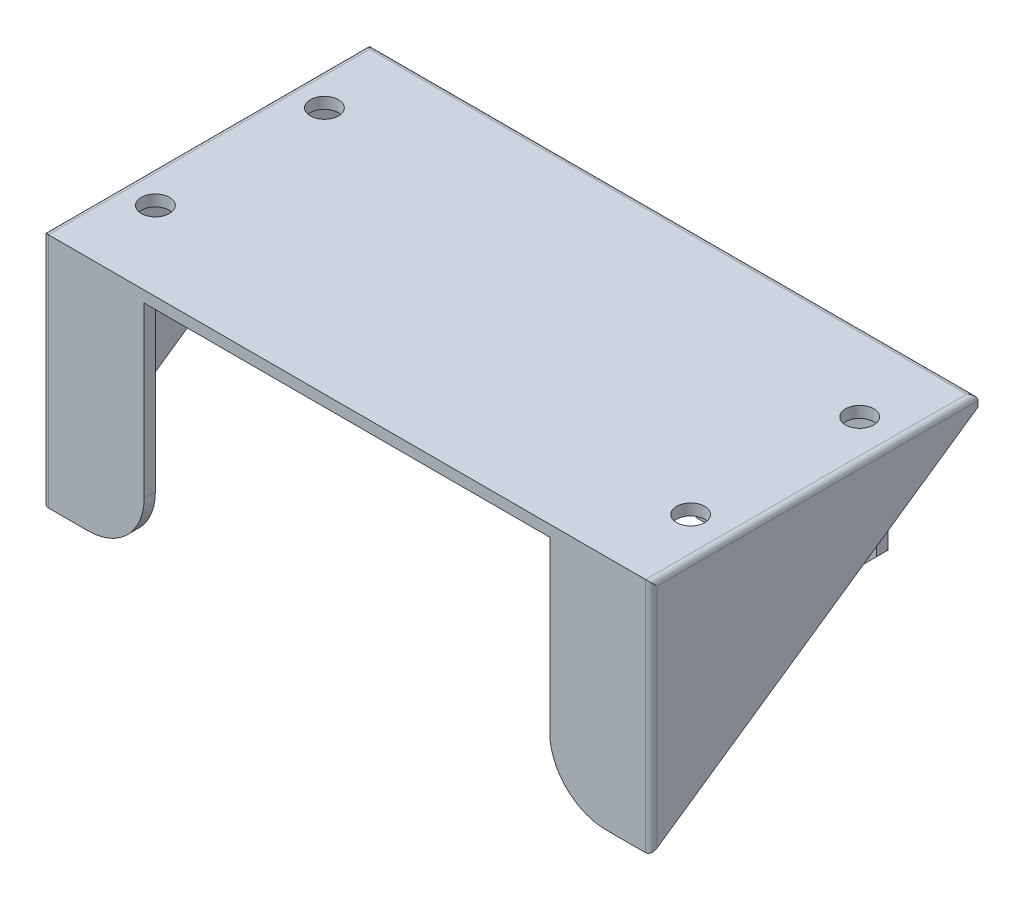
ISO-10303-21;
HEADER;
FILE_DESCRIPTION(('STEP AP214'),'2;1');
FILE_NAME('part.step','',(''),(''),'','','');
FILE_SCHEMA(('AUTOMOTIVE_DESIGN { 1 0 10303 214 1 1 1 1 }'));
ENDSEC;
DATA;
#1=APPLICATION_CONTEXT('core data for automotive mechanical design processes');
#2=APPLICATION_PROTOCOL_DEFINITION('international standard','automotive_design',2000,#1);
#3=PRODUCT_CONTEXT('',#1,'mechanical');
#4=PRODUCT('Part','Part','',(#3));
#5=PRODUCT_RELATED_PRODUCT_CATEGORY('part','',(#4));
#6=PRODUCT_DEFINITION_FORMATION('','',#4);
#7=PRODUCT_DEFINITION_CONTEXT('part definition',#1,'design');
#8=PRODUCT_DEFINITION('design','',#6,#7);
#9=PRODUCT_DEFINITION_SHAPE('','',#8);
#10=(LENGTH_UNIT() NAMED_UNIT(*) SI_UNIT(.MILLI.,.METRE.));
#11=(NAMED_UNIT(*) PLANE_ANGLE_UNIT() SI_UNIT($,.RADIAN.));
#12=(NAMED_UNIT(*) SI_UNIT($,.STERADIAN.) SOLID_ANGLE_UNIT());
#13=UNCERTAINTY_MEASURE_WITH_UNIT(LENGTH_MEASURE(1.E-05),#10,'distance_accuracy_value','');
#14=(GEOMETRIC_REPRESENTATION_CONTEXT(3) GLOBAL_UNCERTAINTY_ASSIGNED_CONTEXT((#13)) GLOBAL_UNIT_ASSIGNED_CONTEXT((#10,
#11,#12)) REPRESENTATION_CONTEXT('',''));
#15=CARTESIAN_POINT('',(0.,0.,0.));
#16=DIRECTION('',(0.,0.,1.));
#17=DIRECTION('',(1.,0.,0.));
#18=AXIS2_PLACEMENT_3D('',#15,#16,#17);
#19=CARTESIAN_POINT('',(-54.,1.,-29.));
#20=DIRECTION('',(0.,0.,1.));
#21=DIRECTION('',(1.,0.,0.));
#22=AXIS2_PLACEMENT_3D('',#19,#20,#21);
#23=PLANE('',#22);
#24=DIRECTION('',(0.,-1.,0.));
#25=VECTOR('',#24,1.);
#26=CARTESIAN_POINT('',(-54.,1.,-29.));
#27=LINE('',#26,#25);
#28=CARTESIAN_POINT('',(-54.,0.5,-29.));
#29=VERTEX_POINT('',#28);
#30=CARTESIAN_POINT('',(-54.,0.,-29.));
#31=VERTEX_POINT('',#30);
#32=EDGE_CURVE('E235',#29,#31,#27,.T.);
#33=ORIENTED_EDGE('',*,*,#32,.F.);
#34=DIRECTION('',(-1.,0.,0.));
#35=VECTOR('',#34,1.);
#36=CARTESIAN_POINT('',(-54.,0.5,-29.));
#37=LINE('',#36,#35);
#38=CARTESIAN_POINT('',(0.,0.5,-29.));
#39=VERTEX_POINT('',#38);
#40=EDGE_CURVE('E282',#29,#39,#37,.F.);
#41=ORIENTED_EDGE('',*,*,#40,.T.);
#42=DIRECTION('',(0.,-1.,0.));
#43=VECTOR('',#42,1.);
#44=CARTESIAN_POINT('',(0.,1.,-29.));
#45=LINE('',#44,#43);
#46=CARTESIAN_POINT('',(0.,0.,-29.));
#47=VERTEX_POINT('',#46);
#48=EDGE_CURVE('E237',#39,#47,#45,.T.);
#49=ORIENTED_EDGE('',*,*,#48,.T.);
#50=DIRECTION('',(-1.,0.,0.));
#51=VECTOR('',#50,1.);
#52=CARTESIAN_POINT('',(-54.,0.,-29.));
#53=LINE('',#52,#51);
#54=CARTESIAN_POINT('',(-1.,0.,-29.));
#55=VERTEX_POINT('',#54);
#56=EDGE_CURVE('E224',#47,#55,#53,.T.);
#57=ORIENTED_EDGE('',*,*,#56,.T.);
#58=CARTESIAN_POINT('',(-8.,0.,-29.));
#59=VERTEX_POINT('',#58);
#60=EDGE_CURVE('E214',#55,#59,#53,.T.);
#61=ORIENTED_EDGE('',*,*,#60,.T.);
#62=DIRECTION('',(0.,1.,0.));
#63=VECTOR('',#62,1.);
#64=CARTESIAN_POINT('',(-8.,-20.,-29.));
#65=LINE('',#64,#63);
#66=CARTESIAN_POINT('',(-8.,-15.,-29.));
#67=VERTEX_POINT('',#66);
#68=EDGE_CURVE('E196',#67,#59,#65,.T.);
#69=ORIENTED_EDGE('',*,*,#68,.F.);
#70=DIRECTION('',(-0.707106781186548,-0.707106781186548,0.));
#71=VECTOR('',#70,1.);
#72=CARTESIAN_POINT('',(-13.,-20.,-29.));
#73=LINE('',#72,#71);
#74=CARTESIAN_POINT('',(-13.,-20.,-29.));
#75=VERTEX_POINT('',#74);
#76=EDGE_CURVE('E255',#67,#75,#73,.T.);
#77=ORIENTED_EDGE('',*,*,#76,.T.);
#78=DIRECTION('',(1.,0.,0.));
#79=VECTOR('',#78,1.);
#80=CARTESIAN_POINT('',(-29.,-20.,-29.));
#81=LINE('',#80,#79);
#82=CARTESIAN_POINT('',(-24.,-20.,-29.));
#83=VERTEX_POINT('',#82);
#84=EDGE_CURVE('E821',#83,#75,#81,.T.);
#85=ORIENTED_EDGE('',*,*,#84,.F.);
#86=DIRECTION('',(-0.707106781186548,0.707106781186548,0.));
#87=VECTOR('',#86,1.);
#88=CARTESIAN_POINT('',(-24.,-20.,-29.));
#89=LINE('',#88,#87);
#90=CARTESIAN_POINT('',(-29.,-15.,-29.));
#91=VERTEX_POINT('',#90);
#92=EDGE_CURVE('E253',#83,#91,#89,.T.);
#93=ORIENTED_EDGE('',*,*,#92,.T.);
#94=DIRECTION('',(0.,1.,0.));
#95=VECTOR('',#94,1.);
#96=CARTESIAN_POINT('',(-29.,-20.,-29.));
#97=LINE('',#96,#95);
#98=CARTESIAN_POINT('',(-29.,0.,-29.));
#99=VERTEX_POINT('',#98);
#100=EDGE_CURVE('E405',#91,#99,#97,.T.);
#101=ORIENTED_EDGE('',*,*,#100,.T.);
#102=CARTESIAN_POINT('',(-53.,0.,-29.));
#103=VERTEX_POINT('',#102);
#104=EDGE_CURVE('E225',#99,#103,#53,.T.);
#105=ORIENTED_EDGE('',*,*,#104,.T.);
#106=DIRECTION('',(-1.,0.,0.));
#107=VECTOR('',#106,1.);
#108=CARTESIAN_POINT('',(-53.,0.,-29.));
#109=LINE('',#108,#107);
#110=EDGE_CURVE('E228',#103,#31,#109,.T.);
#111=ORIENTED_EDGE('',*,*,#110,.T.);
#112=EDGE_LOOP('',(#33,#41,#49,#57,#61,#69,#77,#85,#93,#101,#105,#111));
#113=FACE_BOUND('',#112,.T.);
#114=CARTESIAN_POINT('',(-18.,-10.,-29.));
#115=DIRECTION('',(0.,0.,-1.));
#116=DIRECTION('',(-1.,0.,0.));
#117=AXIS2_PLACEMENT_3D('',#114,#115,#116);
#118=CIRCLE('',#117,1.24999999999999);
#119=CARTESIAN_POINT('',(-19.25,-10.,-29.));
#120=VERTEX_POINT('',#119);
#121=EDGE_CURVE('E297',#120,#120,#118,.T.);
#122=ORIENTED_EDGE('',*,*,#121,.F.);
#123=EDGE_LOOP('',(#122));
#124=FACE_BOUND('',#123,.T.);
#125=ADVANCED_FACE('F37',(#113,#124),#23,.F.);
#126=CARTESIAN_POINT('',(0.,0.,0.));
#127=DIRECTION('',(0.,-1.,0.));
#128=DIRECTION('',(0.,0.,-1.));
#129=AXIS2_PLACEMENT_3D('',#126,#127,#128);
#130=PLANE('',#129);
#131=CARTESIAN_POINT('',(-51.,0.,-22.));
#132=DIRECTION('',(0.,-1.,0.));
#133=DIRECTION('',(0.,0.,-1.));
#134=AXIS2_PLACEMENT_3D('',#131,#132,#133);
#135=CIRCLE('',#134,1.24999999999999);
#136=CARTESIAN_POINT('',(-51.,0.,-23.25));
#137=VERTEX_POINT('',#136);
#138=EDGE_CURVE('E856',#137,#137,#135,.T.);
#139=ORIENTED_EDGE('',*,*,#138,.F.);
#140=EDGE_LOOP('',(#139));
#141=FACE_BOUND('',#140,.T.);
#142=CARTESIAN_POINT('',(-51.,0.,-7.));
#143=DIRECTION('',(0.,-1.,0.));
#144=DIRECTION('',(0.,0.,-1.));
#145=AXIS2_PLACEMENT_3D('',#142,#143,#144);
#146=CIRCLE('',#145,1.24999999999999);
#147=CARTESIAN_POINT('',(-51.,0.,-8.24999999999999));
#148=VERTEX_POINT('',#147);
#149=EDGE_CURVE('E850',#148,#148,#146,.T.);
#150=ORIENTED_EDGE('',*,*,#149,.F.);
#151=EDGE_LOOP('',(#150));
#152=FACE_BOUND('',#151,.T.);
#153=CARTESIAN_POINT('',(-3.5,0.,-7.));
#154=DIRECTION('',(0.,-1.,0.));
#155=DIRECTION('',(0.,0.,-1.));
#156=AXIS2_PLACEMENT_3D('',#153,#154,#155);
#157=CIRCLE('',#156,1.24999999999999);
#158=CARTESIAN_POINT('',(-3.5,0.,-8.24999999999999));
#159=VERTEX_POINT('',#158);
#160=EDGE_CURVE('E844',#159,#159,#157,.T.);
#161=ORIENTED_EDGE('',*,*,#160,.F.);
#162=EDGE_LOOP('',(#161));
#163=FACE_BOUND('',#162,.T.);
#164=CARTESIAN_POINT('',(-3.5,0.,-22.));
#165=DIRECTION('',(0.,-1.,0.));
#166=DIRECTION('',(0.,0.,-1.));
#167=AXIS2_PLACEMENT_3D('',#164,#165,#166);
#168=CIRCLE('',#167,1.24999999999999);
#169=CARTESIAN_POINT('',(-3.5,0.,-23.25));
#170=VERTEX_POINT('',#169);
#171=EDGE_CURVE('E288',#170,#170,#168,.T.);
#172=ORIENTED_EDGE('',*,*,#171,.F.);
#173=EDGE_LOOP('',(#172));
#174=FACE_BOUND('',#173,.T.);
#175=DIRECTION('',(-1.,0.,0.));
#176=VECTOR('',#175,1.);
#177=CARTESIAN_POINT('',(-8.,0.,-28.));
#178=LINE('',#177,#176);
#179=CARTESIAN_POINT('',(-8.,0.,-28.));
#180=VERTEX_POINT('',#179);
#181=CARTESIAN_POINT('',(-29.,0.,-28.));
#182=VERTEX_POINT('',#181);
#183=EDGE_CURVE('E218',#180,#182,#178,.T.);
#184=ORIENTED_EDGE('',*,*,#183,.F.);
#185=DIRECTION('',(0.,0.,1.));
#186=VECTOR('',#185,1.);
#187=CARTESIAN_POINT('',(-8.,0.,-29.));
#188=LINE('',#187,#186);
#189=EDGE_CURVE('E200',#59,#180,#188,.T.);
#190=ORIENTED_EDGE('',*,*,#189,.F.);
#191=ORIENTED_EDGE('',*,*,#60,.F.);
#192=DIRECTION('',(0.,0.,1.));
#193=VECTOR('',#192,1.);
#194=CARTESIAN_POINT('',(-1.,0.,-29.));
#195=LINE('',#194,#193);
#196=CARTESIAN_POINT('',(-1.,0.,-0.999999999999998));
#197=VERTEX_POINT('',#196);
#198=EDGE_CURVE('E359',#55,#197,#195,.T.);
#199=ORIENTED_EDGE('',*,*,#198,.T.);
#200=DIRECTION('',(1.,0.,0.));
#201=VECTOR('',#200,1.);
#202=CARTESIAN_POINT('',(-9.,0.,-0.999999999999998));
#203=LINE('',#202,#201);
#204=CARTESIAN_POINT('',(-9.,0.,-0.999999999999998));
#205=VERTEX_POINT('',#204);
#206=EDGE_CURVE('E356',#205,#197,#203,.T.);
#207=ORIENTED_EDGE('',*,*,#206,.F.);
#208=DIRECTION('',(0.,0.,-1.));
#209=VECTOR('',#208,1.);
#210=CARTESIAN_POINT('',(-9.,0.,-0.999999999999998));
#211=LINE('',#210,#209);
#212=CARTESIAN_POINT('',(-9.,0.,0.));
#213=VERTEX_POINT('',#212);
#214=EDGE_CURVE('E338',#213,#205,#211,.T.);
#215=ORIENTED_EDGE('',*,*,#214,.F.);
#216=DIRECTION('',(1.,0.,0.));
#217=VECTOR('',#216,1.);
#218=CARTESIAN_POINT('',(0.,0.,0.));
#219=LINE('',#218,#217);
#220=CARTESIAN_POINT('',(-45.,0.,0.));
#221=VERTEX_POINT('',#220);
#222=EDGE_CURVE('E227',#221,#213,#219,.T.);
#223=ORIENTED_EDGE('',*,*,#222,.F.);
#224=DIRECTION('',(0.,0.,1.));
#225=VECTOR('',#224,1.);
#226=CARTESIAN_POINT('',(-45.,0.,-0.999999999999998));
#227=LINE('',#226,#225);
#228=CARTESIAN_POINT('',(-45.,0.,-0.999999999999998));
#229=VERTEX_POINT('',#228);
#230=EDGE_CURVE('E322',#229,#221,#227,.T.);
#231=ORIENTED_EDGE('',*,*,#230,.F.);
#232=DIRECTION('',(-1.,0.,0.));
#233=VECTOR('',#232,1.);
#234=CARTESIAN_POINT('',(-45.,0.,-0.999999999999998));
#235=LINE('',#234,#233);
#236=CARTESIAN_POINT('',(-53.,0.,-0.999999999999998));
#237=VERTEX_POINT('',#236);
#238=EDGE_CURVE('E321',#229,#237,#235,.T.);
#239=ORIENTED_EDGE('',*,*,#238,.T.);
#240=DIRECTION('',(0.,0.,-1.));
#241=VECTOR('',#240,1.);
#242=CARTESIAN_POINT('',(-53.,0.,-29.));
#243=LINE('',#242,#241);
#244=EDGE_CURVE('E374',#237,#103,#243,.T.);
#245=ORIENTED_EDGE('',*,*,#244,.T.);
#246=ORIENTED_EDGE('',*,*,#104,.F.);
#247=DIRECTION('',(0.,0.,-1.));
#248=VECTOR('',#247,1.);
#249=CARTESIAN_POINT('',(-29.,0.,-28.));
#250=LINE('',#249,#248);
#251=EDGE_CURVE('E826',#182,#99,#250,.T.);
#252=ORIENTED_EDGE('',*,*,#251,.F.);
#253=EDGE_LOOP('',(#184,#190,#191,#199,#207,#215,#223,#231,#239,#245,#246,#252));
#254=FACE_BOUND('',#253,.T.);
#255=ADVANCED_FACE('F212',(#141,#152,#163,#174,#254),#130,.T.);
#256=CARTESIAN_POINT('',(-53.,0.,0.));
#257=DIRECTION('',(-1.,0.,0.));
#258=DIRECTION('',(0.,0.,1.));
#259=AXIS2_PLACEMENT_3D('',#256,#257,#258);
#260=PLANE('',#259);
#261=DIRECTION('',(0.,1.,0.));
#262=VECTOR('',#261,1.);
#263=CARTESIAN_POINT('',(-53.,0.,-0.999999999999998));
#264=LINE('',#263,#262);
#265=CARTESIAN_POINT('',(-53.,-19.3103448275862,-0.999999999999998));
#266=VERTEX_POINT('',#265);
#267=EDGE_CURVE('E239',#266,#237,#264,.T.);
#268=ORIENTED_EDGE('',*,*,#267,.F.);
#269=DIRECTION('',(0.,-0.56773295580366,0.823212785915306));
#270=VECTOR('',#269,1.);
#271=CARTESIAN_POINT('',(-53.,-20.,0.));
#272=LINE('',#271,#270);
#273=EDGE_CURVE('E371',#103,#266,#272,.T.);
#274=ORIENTED_EDGE('',*,*,#273,.F.);
#275=ORIENTED_EDGE('',*,*,#244,.F.);
#276=EDGE_LOOP('',(#268,#274,#275));
#277=FACE_BOUND('',#276,.T.);
#278=ADVANCED_FACE('F409',(#277),#260,.F.);
#279=CARTESIAN_POINT('',(-1.,0.,0.));
#280=DIRECTION('',(1.,0.,0.));
#281=DIRECTION('',(0.,0.,-1.));
#282=AXIS2_PLACEMENT_3D('',#279,#280,#281);
#283=PLANE('',#282);
#284=DIRECTION('',(0.,-1.,0.));
#285=VECTOR('',#284,1.);
#286=CARTESIAN_POINT('',(-1.,-20.,-0.999999999999998));
#287=LINE('',#286,#285);
#288=CARTESIAN_POINT('',(-1.,-19.3103448275862,-0.999999999999998));
#289=VERTEX_POINT('',#288);
#290=EDGE_CURVE('E348',#197,#289,#287,.T.);
#291=ORIENTED_EDGE('',*,*,#290,.F.);
#292=ORIENTED_EDGE('',*,*,#198,.F.);
#293=DIRECTION('',(0.,0.56773295580366,-0.823212785915306));
#294=VECTOR('',#293,1.);
#295=CARTESIAN_POINT('',(-1.,-20.,0.));
#296=LINE('',#295,#294);
#297=EDGE_CURVE('E361',#289,#55,#296,.T.);
#298=ORIENTED_EDGE('',*,*,#297,.F.);
#299=EDGE_LOOP('',(#291,#292,#298));
#300=FACE_BOUND('',#299,.T.);
#301=ADVANCED_FACE('F442',(#300),#283,.F.);
#302=CARTESIAN_POINT('',(0.,1.,-29.));
#303=DIRECTION('',(-1.,0.,0.));
#304=DIRECTION('',(0.,0.,1.));
#305=AXIS2_PLACEMENT_3D('',#302,#303,#304);
#306=PLANE('',#305);
#307=ORIENTED_EDGE('',*,*,#48,.F.);
#308=DIRECTION('',(0.,0.,-1.));
#309=VECTOR('',#308,1.);
#310=CARTESIAN_POINT('',(0.,0.5,-29.));
#311=LINE('',#310,#309);
#312=CARTESIAN_POINT('',(0.,0.5,-0.5));
#313=VERTEX_POINT('',#312);
#314=EDGE_CURVE('E268',#39,#313,#311,.F.);
#315=ORIENTED_EDGE('',*,*,#314,.T.);
#316=DIRECTION('',(0.,-1.,0.));
#317=VECTOR('',#316,1.);
#318=CARTESIAN_POINT('',(0.,1.,-0.5));
#319=LINE('',#318,#317);
#320=CARTESIAN_POINT('',(0.,-19.6551724137931,-0.5));
#321=VERTEX_POINT('',#320);
#322=EDGE_CURVE('E266',#313,#321,#319,.T.);
#323=ORIENTED_EDGE('',*,*,#322,.T.);
#324=DIRECTION('',(0.,0.56773295580366,-0.823212785915306));
#325=VECTOR('',#324,1.);
#326=CARTESIAN_POINT('',(0.,-20.,0.));
#327=LINE('',#326,#325);
#328=EDGE_CURVE('E358',#321,#47,#327,.T.);
#329=ORIENTED_EDGE('',*,*,#328,.T.);
#330=EDGE_LOOP('',(#307,#315,#323,#329));
#331=FACE_BOUND('',#330,.T.);
#332=ADVANCED_FACE('F439',(#331),#306,.F.);
#333=CARTESIAN_POINT('',(-54.,1.,0.));
#334=DIRECTION('',(1.,0.,0.));
#335=DIRECTION('',(0.,0.,-1.));
#336=AXIS2_PLACEMENT_3D('',#333,#334,#335);
#337=PLANE('',#336);
#338=DIRECTION('',(0.,-0.56773295580366,0.823212785915306));
#339=VECTOR('',#338,1.);
#340=CARTESIAN_POINT('',(-54.,-20.,0.));
#341=LINE('',#340,#339);
#342=CARTESIAN_POINT('',(-54.,-19.6551724137931,-0.5));
#343=VERTEX_POINT('',#342);
#344=EDGE_CURVE('E370',#31,#343,#341,.T.);
#345=ORIENTED_EDGE('',*,*,#344,.T.);
#346=DIRECTION('',(0.,-1.,0.));
#347=VECTOR('',#346,1.);
#348=CARTESIAN_POINT('',(-54.,1.,-0.5));
#349=LINE('',#348,#347);
#350=CARTESIAN_POINT('',(-54.,0.5,-0.5));
#351=VERTEX_POINT('',#350);
#352=EDGE_CURVE('E280',#343,#351,#349,.F.);
#353=ORIENTED_EDGE('',*,*,#352,.T.);
#354=DIRECTION('',(0.,0.,1.));
#355=VECTOR('',#354,1.);
#356=CARTESIAN_POINT('',(-54.,0.5,0.));
#357=LINE('',#356,#355);
#358=EDGE_CURVE('E278',#351,#29,#357,.F.);
#359=ORIENTED_EDGE('',*,*,#358,.T.);
#360=ORIENTED_EDGE('',*,*,#32,.T.);
#361=EDGE_LOOP('',(#345,#353,#359,#360));
#362=FACE_BOUND('',#361,.T.);
#363=ADVANCED_FACE('F400',(#362),#337,.F.);
#364=CARTESIAN_POINT('',(0.,1.,0.));
#365=DIRECTION('',(0.,0.,-1.));
#366=DIRECTION('',(-1.,0.,0.));
#367=AXIS2_PLACEMENT_3D('',#364,#365,#366);
#368=PLANE('',#367);
#369=DIRECTION('',(0.,1.,0.));
#370=VECTOR('',#369,1.);
#371=CARTESIAN_POINT('',(-9.,0.,0.));
#372=LINE('',#371,#370);
#373=CARTESIAN_POINT('',(-9.,-15.,0.));
#374=VERTEX_POINT('',#373);
#375=EDGE_CURVE('E345',#374,#213,#372,.T.);
#376=ORIENTED_EDGE('',*,*,#375,.F.);
#377=CARTESIAN_POINT('',(-4.,-15.,0.));
#378=DIRECTION('',(0.,0.,-1.));
#379=DIRECTION('',(-1.,0.,0.));
#380=AXIS2_PLACEMENT_3D('',#377,#378,#379);
#381=CIRCLE('',#380,5.);
#382=CARTESIAN_POINT('',(-4.,-20.,0.));
#383=VERTEX_POINT('',#382);
#384=EDGE_CURVE('E302',#374,#383,#381,.F.);
#385=ORIENTED_EDGE('',*,*,#384,.T.);
#386=DIRECTION('',(1.,0.,0.));
#387=VECTOR('',#386,1.);
#388=CARTESIAN_POINT('',(-9.,-20.,0.));
#389=LINE('',#388,#387);
#390=CARTESIAN_POINT('',(-1.,-20.,0.));
#391=VERTEX_POINT('',#390);
#392=EDGE_CURVE('E347',#383,#391,#389,.T.);
#393=ORIENTED_EDGE('',*,*,#392,.T.);
#394=DIRECTION('',(1.,0.,0.));
#395=VECTOR('',#394,1.);
#396=CARTESIAN_POINT('',(-1.,-20.,0.));
#397=LINE('',#396,#395);
#398=CARTESIAN_POINT('',(-0.5,-20.,0.));
#399=VERTEX_POINT('',#398);
#400=EDGE_CURVE('E365',#391,#399,#397,.T.);
#401=ORIENTED_EDGE('',*,*,#400,.T.);
#402=DIRECTION('',(0.,-1.,0.));
#403=VECTOR('',#402,1.);
#404=CARTESIAN_POINT('',(-0.5,1.,0.));
#405=LINE('',#404,#403);
#406=CARTESIAN_POINT('',(-0.5,1.,0.));
#407=VERTEX_POINT('',#406);
#408=EDGE_CURVE('E274',#399,#407,#405,.F.);
#409=ORIENTED_EDGE('',*,*,#408,.T.);
#410=DIRECTION('',(1.,0.,0.));
#411=VECTOR('',#410,1.);
#412=CARTESIAN_POINT('',(0.,1.,0.));
#413=LINE('',#412,#411);
#414=CARTESIAN_POINT('',(-53.5,1.,0.));
#415=VERTEX_POINT('',#414);
#416=EDGE_CURVE('E231',#415,#407,#413,.T.);
#417=ORIENTED_EDGE('',*,*,#416,.F.);
#418=DIRECTION('',(0.,-1.,0.));
#419=VECTOR('',#418,1.);
#420=CARTESIAN_POINT('',(-53.5,1.,0.));
#421=LINE('',#420,#419);
#422=CARTESIAN_POINT('',(-53.5,-20.,0.));
#423=VERTEX_POINT('',#422);
#424=EDGE_CURVE('E272',#415,#423,#421,.T.);
#425=ORIENTED_EDGE('',*,*,#424,.T.);
#426=DIRECTION('',(-1.,0.,0.));
#427=VECTOR('',#426,1.);
#428=CARTESIAN_POINT('',(-53.,-20.,0.));
#429=LINE('',#428,#427);
#430=CARTESIAN_POINT('',(-53.,-20.,0.));
#431=VERTEX_POINT('',#430);
#432=EDGE_CURVE('E378',#431,#423,#429,.T.);
#433=ORIENTED_EDGE('',*,*,#432,.F.);
#434=DIRECTION('',(-1.,0.,0.));
#435=VECTOR('',#434,1.);
#436=CARTESIAN_POINT('',(-45.,-20.,0.));
#437=LINE('',#436,#435);
#438=CARTESIAN_POINT('',(-50.,-20.,0.));
#439=VERTEX_POINT('',#438);
#440=EDGE_CURVE('E335',#439,#431,#437,.T.);
#441=ORIENTED_EDGE('',*,*,#440,.F.);
#442=CARTESIAN_POINT('',(-50.,-15.,0.));
#443=DIRECTION('',(0.,0.,-1.));
#444=DIRECTION('',(-1.,0.,0.));
#445=AXIS2_PLACEMENT_3D('',#442,#443,#444);
#446=CIRCLE('',#445,5.);
#447=CARTESIAN_POINT('',(-45.,-15.,0.));
#448=VERTEX_POINT('',#447);
#449=EDGE_CURVE('E300',#439,#448,#446,.F.);
#450=ORIENTED_EDGE('',*,*,#449,.T.);
#451=DIRECTION('',(0.,-1.,0.));
#452=VECTOR('',#451,1.);
#453=CARTESIAN_POINT('',(-45.,0.,0.));
#454=LINE('',#453,#452);
#455=EDGE_CURVE('E316',#221,#448,#454,.T.);
#456=ORIENTED_EDGE('',*,*,#455,.F.);
#457=ORIENTED_EDGE('',*,*,#222,.T.);
#458=EDGE_LOOP('',(#376,#385,#393,#401,#409,#417,#425,#433,#441,#450,#456,#457));
#459=FACE_BOUND('',#458,.T.);
#460=ADVANCED_FACE('F416',(#459),#368,.F.);
#461=CARTESIAN_POINT('',(0.,1.,0.));
#462=DIRECTION('',(0.,-1.,0.));
#463=DIRECTION('',(0.,0.,-1.));
#464=AXIS2_PLACEMENT_3D('',#461,#462,#463);
#465=PLANE('',#464);
#466=CARTESIAN_POINT('',(-51.,1.,-22.));
#467=DIRECTION('',(0.,1.,0.));
#468=DIRECTION('',(0.,0.,1.));
#469=AXIS2_PLACEMENT_3D('',#466,#467,#468);
#470=CIRCLE('',#469,1.24999999999999);
#471=CARTESIAN_POINT('',(-51.,1.,-20.75));
#472=VERTEX_POINT('',#471);
#473=EDGE_CURVE('E859',#472,#472,#470,.T.);
#474=ORIENTED_EDGE('',*,*,#473,.F.);
#475=EDGE_LOOP('',(#474));
#476=FACE_BOUND('',#475,.T.);
#477=CARTESIAN_POINT('',(-51.,1.,-7.));
#478=DIRECTION('',(0.,1.,0.));
#479=DIRECTION('',(0.,0.,1.));
#480=AXIS2_PLACEMENT_3D('',#477,#478,#479);
#481=CIRCLE('',#480,1.24999999999999);
#482=CARTESIAN_POINT('',(-51.,1.,-5.75000000000001));
#483=VERTEX_POINT('',#482);
#484=EDGE_CURVE('E853',#483,#483,#481,.T.);
#485=ORIENTED_EDGE('',*,*,#484,.F.);
#486=EDGE_LOOP('',(#485));
#487=FACE_BOUND('',#486,.T.);
#488=CARTESIAN_POINT('',(-3.5,1.,-7.));
#489=DIRECTION('',(0.,1.,0.));
#490=DIRECTION('',(0.,0.,1.));
#491=AXIS2_PLACEMENT_3D('',#488,#489,#490);
#492=CIRCLE('',#491,1.24999999999999);
#493=CARTESIAN_POINT('',(-3.5,1.,-5.75000000000001));
#494=VERTEX_POINT('',#493);
#495=EDGE_CURVE('E847',#494,#494,#492,.T.);
#496=ORIENTED_EDGE('',*,*,#495,.F.);
#497=EDGE_LOOP('',(#496));
#498=FACE_BOUND('',#497,.T.);
#499=CARTESIAN_POINT('',(-3.5,1.,-22.));
#500=DIRECTION('',(0.,1.,0.));
#501=DIRECTION('',(0.,0.,1.));
#502=AXIS2_PLACEMENT_3D('',#499,#500,#501);
#503=CIRCLE('',#502,1.24999999999999);
#504=CARTESIAN_POINT('',(-3.5,1.,-20.75));
#505=VERTEX_POINT('',#504);
#506=EDGE_CURVE('E841',#505,#505,#503,.T.);
#507=ORIENTED_EDGE('',*,*,#506,.F.);
#508=EDGE_LOOP('',(#507));
#509=FACE_BOUND('',#508,.T.);
#510=ORIENTED_EDGE('',*,*,#416,.T.);
#511=DIRECTION('',(0.,0.,-1.));
#512=VECTOR('',#511,1.);
#513=CARTESIAN_POINT('',(-0.5,1.,0.));
#514=LINE('',#513,#512);
#515=CARTESIAN_POINT('',(-0.5,1.,-28.5));
#516=VERTEX_POINT('',#515);
#517=EDGE_CURVE('E263',#407,#516,#514,.T.);
#518=ORIENTED_EDGE('',*,*,#517,.T.);
#519=DIRECTION('',(-1.,0.,0.));
#520=VECTOR('',#519,1.);
#521=CARTESIAN_POINT('',(0.,1.,-28.5));
#522=LINE('',#521,#520);
#523=CARTESIAN_POINT('',(-53.5,1.,-28.5));
#524=VERTEX_POINT('',#523);
#525=EDGE_CURVE('E259',#516,#524,#522,.T.);
#526=ORIENTED_EDGE('',*,*,#525,.T.);
#527=DIRECTION('',(0.,0.,1.));
#528=VECTOR('',#527,1.);
#529=CARTESIAN_POINT('',(-53.5,1.,0.));
#530=LINE('',#529,#528);
#531=EDGE_CURVE('E261',#524,#415,#530,.T.);
#532=ORIENTED_EDGE('',*,*,#531,.T.);
#533=EDGE_LOOP('',(#510,#518,#526,#532));
#534=FACE_BOUND('',#533,.T.);
#535=ADVANCED_FACE('F519',(#476,#487,#498,#509,#534),#465,.F.);
#536=CARTESIAN_POINT('',(-53.,-20.,0.));
#537=DIRECTION('',(0.,-0.823212785915306,-0.56773295580366));
#538=DIRECTION('',(0.,0.56773295580366,-0.823212785915306));
#539=AXIS2_PLACEMENT_3D('',#536,#537,#538);
#540=PLANE('',#539);
#541=ORIENTED_EDGE('',*,*,#432,.T.);
#542=CARTESIAN_POINT('',(-53.5,-19.6551724137931,-0.5));
#543=DIRECTION('',(0.,-0.823212785915306,-0.56773295580366));
#544=DIRECTION('',(0.,-0.56773295580366,0.823212785915306));
#545=AXIS2_PLACEMENT_3D('',#542,#543,#544);
#546=ELLIPSE('',#545,0.607376377717536,0.5);
#547=EDGE_CURVE('E276',#423,#343,#546,.T.);
#548=ORIENTED_EDGE('',*,*,#547,.T.);
#549=ORIENTED_EDGE('',*,*,#344,.F.);
#550=ORIENTED_EDGE('',*,*,#110,.F.);
#551=ORIENTED_EDGE('',*,*,#273,.T.);
#552=EDGE_CURVE('E375',#266,#431,#272,.T.);
#553=ORIENTED_EDGE('',*,*,#552,.T.);
#554=EDGE_LOOP('',(#541,#548,#549,#550,#551,#553));
#555=FACE_BOUND('',#554,.T.);
#556=ADVANCED_FACE('F387',(#555),#540,.T.);
#557=CARTESIAN_POINT('',(-1.,-20.,0.));
#558=DIRECTION('',(0.,-0.823212785915306,-0.56773295580366));
#559=DIRECTION('',(0.,0.56773295580366,-0.823212785915306));
#560=AXIS2_PLACEMENT_3D('',#557,#558,#559);
#561=PLANE('',#560);
#562=ORIENTED_EDGE('',*,*,#328,.F.);
#563=CARTESIAN_POINT('',(-0.5,-19.6551724137931,-0.5));
#564=DIRECTION('',(0.,-0.823212785915306,-0.56773295580366));
#565=DIRECTION('',(0.,-0.56773295580366,0.823212785915306));
#566=AXIS2_PLACEMENT_3D('',#563,#564,#565);
#567=ELLIPSE('',#566,0.607376377717536,0.5);
#568=EDGE_CURVE('E270',#321,#399,#567,.T.);
#569=ORIENTED_EDGE('',*,*,#568,.T.);
#570=ORIENTED_EDGE('',*,*,#400,.F.);
#571=EDGE_CURVE('E362',#391,#289,#296,.T.);
#572=ORIENTED_EDGE('',*,*,#571,.T.);
#573=ORIENTED_EDGE('',*,*,#297,.T.);
#574=ORIENTED_EDGE('',*,*,#56,.F.);
#575=EDGE_LOOP('',(#562,#569,#570,#572,#573,#574));
#576=FACE_BOUND('',#575,.T.);
#577=ADVANCED_FACE('F617',(#576),#561,.T.);
#578=CARTESIAN_POINT('',(-9.,-20.,-0.999999999999998));
#579=DIRECTION('',(0.,0.,1.));
#580=DIRECTION('',(1.,0.,0.));
#581=AXIS2_PLACEMENT_3D('',#578,#579,#580);
#582=PLANE('',#581);
#583=DIRECTION('',(1.,0.,0.));
#584=VECTOR('',#583,1.);
#585=CARTESIAN_POINT('',(-9.,-20.,-0.999999999999998));
#586=LINE('',#585,#584);
#587=CARTESIAN_POINT('',(-4.,-20.,-0.999999999999998));
#588=VERTEX_POINT('',#587);
#589=CARTESIAN_POINT('',(-1.,-20.,-0.999999999999998));
#590=VERTEX_POINT('',#589);
#591=EDGE_CURVE('E354',#588,#590,#586,.T.);
#592=ORIENTED_EDGE('',*,*,#591,.F.);
#593=CARTESIAN_POINT('',(-4.,-15.,-0.999999999999998));
#594=DIRECTION('',(0.,0.,1.));
#595=DIRECTION('',(1.,0.,0.));
#596=AXIS2_PLACEMENT_3D('',#593,#594,#595);
#597=CIRCLE('',#596,5.);
#598=CARTESIAN_POINT('',(-9.,-15.,-0.999999999999998));
#599=VERTEX_POINT('',#598);
#600=EDGE_CURVE('E306',#588,#599,#597,.F.);
#601=ORIENTED_EDGE('',*,*,#600,.T.);
#602=DIRECTION('',(0.,-1.,0.));
#603=VECTOR('',#602,1.);
#604=CARTESIAN_POINT('',(-9.,-20.,-0.999999999999998));
#605=LINE('',#604,#603);
#606=EDGE_CURVE('E341',#205,#599,#605,.T.);
#607=ORIENTED_EDGE('',*,*,#606,.F.);
#608=ORIENTED_EDGE('',*,*,#206,.T.);
#609=ORIENTED_EDGE('',*,*,#290,.T.);
#610=EDGE_CURVE('E337',#289,#590,#287,.T.);
#611=ORIENTED_EDGE('',*,*,#610,.T.);
#612=EDGE_LOOP('',(#592,#601,#607,#608,#609,#611));
#613=FACE_BOUND('',#612,.T.);
#614=ADVANCED_FACE('F613',(#613),#582,.F.);
#615=CARTESIAN_POINT('',(-9.,-20.,0.));
#616=DIRECTION('',(0.,1.,0.));
#617=DIRECTION('',(0.,0.,1.));
#618=AXIS2_PLACEMENT_3D('',#615,#616,#617);
#619=PLANE('',#618);
#620=ORIENTED_EDGE('',*,*,#392,.F.);
#621=DIRECTION('',(0.,0.,1.));
#622=VECTOR('',#621,1.);
#623=CARTESIAN_POINT('',(-4.,-20.,0.));
#624=LINE('',#623,#622);
#625=EDGE_CURVE('E304',#383,#588,#624,.F.);
#626=ORIENTED_EDGE('',*,*,#625,.T.);
#627=ORIENTED_EDGE('',*,*,#591,.T.);
#628=DIRECTION('',(0.,0.,1.));
#629=VECTOR('',#628,1.);
#630=CARTESIAN_POINT('',(-1.,-20.,0.));
#631=LINE('',#630,#629);
#632=EDGE_CURVE('E342',#590,#391,#631,.T.);
#633=ORIENTED_EDGE('',*,*,#632,.T.);
#634=EDGE_LOOP('',(#620,#626,#627,#633));
#635=FACE_BOUND('',#634,.T.);
#636=ADVANCED_FACE('F606',(#635),#619,.F.);
#637=CARTESIAN_POINT('',(-9.,0.,0.));
#638=DIRECTION('',(1.,0.,0.));
#639=DIRECTION('',(0.,0.,-1.));
#640=AXIS2_PLACEMENT_3D('',#637,#638,#639);
#641=PLANE('',#640);
#642=ORIENTED_EDGE('',*,*,#606,.T.);
#643=DIRECTION('',(0.,0.,1.));
#644=VECTOR('',#643,1.);
#645=CARTESIAN_POINT('',(-9.,-15.,0.));
#646=LINE('',#645,#644);
#647=EDGE_CURVE('E284',#599,#374,#646,.T.);
#648=ORIENTED_EDGE('',*,*,#647,.T.);
#649=ORIENTED_EDGE('',*,*,#375,.T.);
#650=ORIENTED_EDGE('',*,*,#214,.T.);
#651=EDGE_LOOP('',(#642,#648,#649,#650));
#652=FACE_BOUND('',#651,.T.);
#653=ADVANCED_FACE('F603',(#652),#641,.F.);
#654=CARTESIAN_POINT('',(-1.,0.,0.));
#655=DIRECTION('',(1.,0.,0.));
#656=DIRECTION('',(0.,0.,-1.));
#657=AXIS2_PLACEMENT_3D('',#654,#655,#656);
#658=PLANE('',#657);
#659=ORIENTED_EDGE('',*,*,#610,.F.);
#660=ORIENTED_EDGE('',*,*,#571,.F.);
#661=ORIENTED_EDGE('',*,*,#632,.F.);
#662=EDGE_LOOP('',(#659,#660,#661));
#663=FACE_BOUND('',#662,.T.);
#664=ADVANCED_FACE('F602',(#663),#658,.T.);
#665=CARTESIAN_POINT('',(-45.,-20.,0.));
#666=DIRECTION('',(0.,1.,0.));
#667=DIRECTION('',(0.,0.,1.));
#668=AXIS2_PLACEMENT_3D('',#665,#666,#667);
#669=PLANE('',#668);
#670=DIRECTION('',(-1.,0.,0.));
#671=VECTOR('',#670,1.);
#672=CARTESIAN_POINT('',(-45.,-20.,-0.999999999999998));
#673=LINE('',#672,#671);
#674=CARTESIAN_POINT('',(-50.,-20.,-0.999999999999998));
#675=VERTEX_POINT('',#674);
#676=CARTESIAN_POINT('',(-53.,-20.,-0.999999999999998));
#677=VERTEX_POINT('',#676);
#678=EDGE_CURVE('E333',#675,#677,#673,.T.);
#679=ORIENTED_EDGE('',*,*,#678,.F.);
#680=DIRECTION('',(0.,0.,-1.));
#681=VECTOR('',#680,1.);
#682=CARTESIAN_POINT('',(-50.,-20.,0.));
#683=LINE('',#682,#681);
#684=EDGE_CURVE('E11',#675,#439,#683,.F.);
#685=ORIENTED_EDGE('',*,*,#684,.T.);
#686=ORIENTED_EDGE('',*,*,#440,.T.);
#687=DIRECTION('',(0.,0.,-1.));
#688=VECTOR('',#687,1.);
#689=CARTESIAN_POINT('',(-53.,-20.,0.));
#690=LINE('',#689,#688);
#691=EDGE_CURVE('E207',#431,#677,#690,.T.);
#692=ORIENTED_EDGE('',*,*,#691,.T.);
#693=EDGE_LOOP('',(#679,#685,#686,#692));
#694=FACE_BOUND('',#693,.T.);
#695=ADVANCED_FACE('F414',(#694),#669,.F.);
#696=CARTESIAN_POINT('',(-45.,-20.,-0.999999999999998));
#697=DIRECTION('',(0.,0.,1.));
#698=DIRECTION('',(1.,0.,0.));
#699=AXIS2_PLACEMENT_3D('',#696,#697,#698);
#700=PLANE('',#699);
#701=DIRECTION('',(0.,1.,0.));
#702=VECTOR('',#701,1.);
#703=CARTESIAN_POINT('',(-45.,-20.,-0.999999999999998));
#704=LINE('',#703,#702);
#705=CARTESIAN_POINT('',(-45.,-15.,-0.999999999999998));
#706=VERTEX_POINT('',#705);
#707=EDGE_CURVE('E313',#706,#229,#704,.T.);
#708=ORIENTED_EDGE('',*,*,#707,.F.);
#709=CARTESIAN_POINT('',(-50.,-15.,-0.999999999999998));
#710=DIRECTION('',(0.,0.,1.));
#711=DIRECTION('',(1.,0.,0.));
#712=AXIS2_PLACEMENT_3D('',#709,#710,#711);
#713=CIRCLE('',#712,5.);
#714=EDGE_CURVE('E45',#706,#675,#713,.F.);
#715=ORIENTED_EDGE('',*,*,#714,.T.);
#716=ORIENTED_EDGE('',*,*,#678,.T.);
#717=DIRECTION('',(0.,1.,0.));
#718=VECTOR('',#717,1.);
#719=CARTESIAN_POINT('',(-53.,-20.,-0.999999999999998));
#720=LINE('',#719,#718);
#721=EDGE_CURVE('E325',#677,#266,#720,.T.);
#722=ORIENTED_EDGE('',*,*,#721,.T.);
#723=ORIENTED_EDGE('',*,*,#267,.T.);
#724=ORIENTED_EDGE('',*,*,#238,.F.);
#725=EDGE_LOOP('',(#708,#715,#716,#722,#723,#724));
#726=FACE_BOUND('',#725,.T.);
#727=ADVANCED_FACE('F319',(#726),#700,.F.);
#728=CARTESIAN_POINT('',(-45.,0.,0.));
#729=DIRECTION('',(1.,0.,0.));
#730=DIRECTION('',(0.,0.,-1.));
#731=AXIS2_PLACEMENT_3D('',#728,#729,#730);
#732=PLANE('',#731);
#733=ORIENTED_EDGE('',*,*,#455,.T.);
#734=DIRECTION('',(0.,0.,-1.));
#735=VECTOR('',#734,1.);
#736=CARTESIAN_POINT('',(-45.,-15.,-0.999999999999998));
#737=LINE('',#736,#735);
#738=EDGE_CURVE('E308',#448,#706,#737,.T.);
#739=ORIENTED_EDGE('',*,*,#738,.T.);
#740=ORIENTED_EDGE('',*,*,#707,.T.);
#741=ORIENTED_EDGE('',*,*,#230,.T.);
#742=EDGE_LOOP('',(#733,#739,#740,#741));
#743=FACE_BOUND('',#742,.T.);
#744=ADVANCED_FACE('F311',(#743),#732,.T.);
#745=CARTESIAN_POINT('',(-53.,0.,0.));
#746=DIRECTION('',(1.,0.,0.));
#747=DIRECTION('',(0.,0.,-1.));
#748=AXIS2_PLACEMENT_3D('',#745,#746,#747);
#749=PLANE('',#748);
#750=ORIENTED_EDGE('',*,*,#552,.F.);
#751=ORIENTED_EDGE('',*,*,#721,.F.);
#752=ORIENTED_EDGE('',*,*,#691,.F.);
#753=EDGE_LOOP('',(#750,#751,#752));
#754=FACE_BOUND('',#753,.T.);
#755=ADVANCED_FACE('F412',(#754),#749,.F.);
#756=CARTESIAN_POINT('',(-8.,-20.,-29.));
#757=DIRECTION('',(-1.,0.,0.));
#758=DIRECTION('',(0.,0.,1.));
#759=AXIS2_PLACEMENT_3D('',#756,#757,#758);
#760=PLANE('',#759);
#761=DIRECTION('',(0.,1.,0.));
#762=VECTOR('',#761,1.);
#763=CARTESIAN_POINT('',(-8.,-20.,-28.));
#764=LINE('',#763,#762);
#765=CARTESIAN_POINT('',(-8.,-15.,-28.));
#766=VERTEX_POINT('',#765);
#767=EDGE_CURVE('E208',#766,#180,#764,.T.);
#768=ORIENTED_EDGE('',*,*,#767,.F.);
#769=DIRECTION('',(0.,0.,-1.));
#770=VECTOR('',#769,1.);
#771=CARTESIAN_POINT('',(-8.,-15.,-29.));
#772=LINE('',#771,#770);
#773=EDGE_CURVE('E203',#766,#67,#772,.T.);
#774=ORIENTED_EDGE('',*,*,#773,.T.);
#775=ORIENTED_EDGE('',*,*,#68,.T.);
#776=ORIENTED_EDGE('',*,*,#189,.T.);
#777=EDGE_LOOP('',(#768,#774,#775,#776));
#778=FACE_BOUND('',#777,.T.);
#779=ADVANCED_FACE('F199',(#778),#760,.F.);
#780=CARTESIAN_POINT('',(-8.,-20.,-28.));
#781=DIRECTION('',(0.,0.,-1.));
#782=DIRECTION('',(-1.,0.,0.));
#783=AXIS2_PLACEMENT_3D('',#780,#781,#782);
#784=PLANE('',#783);
#785=CARTESIAN_POINT('',(-18.,-10.,-28.));
#786=DIRECTION('',(0.,0.,-1.));
#787=DIRECTION('',(-1.,0.,0.));
#788=AXIS2_PLACEMENT_3D('',#785,#786,#787);
#789=CIRCLE('',#788,1.24999999999999);
#790=CARTESIAN_POINT('',(-19.25,-10.,-28.));
#791=VERTEX_POINT('',#790);
#792=EDGE_CURVE('E219',#791,#791,#789,.T.);
#793=ORIENTED_EDGE('',*,*,#792,.T.);
#794=EDGE_LOOP('',(#793));
#795=FACE_BOUND('',#794,.T.);
#796=DIRECTION('',(-1.,0.,0.));
#797=VECTOR('',#796,1.);
#798=CARTESIAN_POINT('',(-8.,-20.,-28.));
#799=LINE('',#798,#797);
#800=CARTESIAN_POINT('',(-13.,-20.,-28.));
#801=VERTEX_POINT('',#800);
#802=CARTESIAN_POINT('',(-24.,-20.,-28.));
#803=VERTEX_POINT('',#802);
#804=EDGE_CURVE('E817',#801,#803,#799,.T.);
#805=ORIENTED_EDGE('',*,*,#804,.F.);
#806=DIRECTION('',(0.707106781186548,0.707106781186548,0.));
#807=VECTOR('',#806,1.);
#808=CARTESIAN_POINT('',(-13.,-20.,-28.));
#809=LINE('',#808,#807);
#810=EDGE_CURVE('E250',#801,#766,#809,.T.);
#811=ORIENTED_EDGE('',*,*,#810,.T.);
#812=ORIENTED_EDGE('',*,*,#767,.T.);
#813=ORIENTED_EDGE('',*,*,#183,.T.);
#814=DIRECTION('',(0.,1.,0.));
#815=VECTOR('',#814,1.);
#816=CARTESIAN_POINT('',(-29.,-20.,-28.));
#817=LINE('',#816,#815);
#818=CARTESIAN_POINT('',(-29.,-15.,-28.));
#819=VERTEX_POINT('',#818);
#820=EDGE_CURVE('E823',#819,#182,#817,.T.);
#821=ORIENTED_EDGE('',*,*,#820,.F.);
#822=DIRECTION('',(0.707106781186548,-0.707106781186548,0.));
#823=VECTOR('',#822,1.);
#824=CARTESIAN_POINT('',(-24.,-20.,-28.));
#825=LINE('',#824,#823);
#826=EDGE_CURVE('E248',#819,#803,#825,.T.);
#827=ORIENTED_EDGE('',*,*,#826,.T.);
#828=EDGE_LOOP('',(#805,#811,#812,#813,#821,#827));
#829=FACE_BOUND('',#828,.T.);
#830=ADVANCED_FACE('F588',(#795,#829),#784,.F.);
#831=CARTESIAN_POINT('',(-29.,-20.,-28.));
#832=DIRECTION('',(1.,0.,0.));
#833=DIRECTION('',(0.,0.,-1.));
#834=AXIS2_PLACEMENT_3D('',#831,#832,#833);
#835=PLANE('',#834);
#836=ORIENTED_EDGE('',*,*,#100,.F.);
#837=DIRECTION('',(0.,0.,1.));
#838=VECTOR('',#837,1.);
#839=CARTESIAN_POINT('',(-29.,-15.,-28.));
#840=LINE('',#839,#838);
#841=EDGE_CURVE('E257',#91,#819,#840,.T.);
#842=ORIENTED_EDGE('',*,*,#841,.T.);
#843=ORIENTED_EDGE('',*,*,#820,.T.);
#844=ORIENTED_EDGE('',*,*,#251,.T.);
#845=EDGE_LOOP('',(#836,#842,#843,#844));
#846=FACE_BOUND('',#845,.T.);
#847=ADVANCED_FACE('F584',(#846),#835,.F.);
#848=CARTESIAN_POINT('',(0.,-20.,0.));
#849=DIRECTION('',(0.,-1.,0.));
#850=DIRECTION('',(0.,0.,-1.));
#851=AXIS2_PLACEMENT_3D('',#848,#849,#850);
#852=PLANE('',#851);
#853=ORIENTED_EDGE('',*,*,#84,.T.);
#854=DIRECTION('',(0.,0.,1.));
#855=VECTOR('',#854,1.);
#856=CARTESIAN_POINT('',(-13.,-20.,-28.));
#857=LINE('',#856,#855);
#858=EDGE_CURVE('E245',#75,#801,#857,.T.);
#859=ORIENTED_EDGE('',*,*,#858,.T.);
#860=ORIENTED_EDGE('',*,*,#804,.T.);
#861=DIRECTION('',(0.,0.,-1.));
#862=VECTOR('',#861,1.);
#863=CARTESIAN_POINT('',(-24.,-20.,-29.));
#864=LINE('',#863,#862);
#865=EDGE_CURVE('E242',#803,#83,#864,.T.);
#866=ORIENTED_EDGE('',*,*,#865,.T.);
#867=EDGE_LOOP('',(#853,#859,#860,#866));
#868=FACE_BOUND('',#867,.T.);
#869=ADVANCED_FACE('F580',(#868),#852,.T.);
#870=CARTESIAN_POINT('',(-18.,-10.,-29.));
#871=DIRECTION('',(0.,0.,-1.));
#872=DIRECTION('',(-1.,0.,0.));
#873=AXIS2_PLACEMENT_3D('',#870,#871,#872);
#874=CYLINDRICAL_SURFACE('',#873,1.24999999999999);
#875=ORIENTED_EDGE('',*,*,#792,.F.);
#876=EDGE_LOOP('',(#875));
#877=FACE_BOUND('',#876,.T.);
#878=ORIENTED_EDGE('',*,*,#121,.T.);
#879=EDGE_LOOP('',(#878));
#880=FACE_BOUND('',#879,.T.);
#881=ADVANCED_FACE('F448',(#877,#880),#874,.F.);
#882=CARTESIAN_POINT('',(-13.,-20.,0.));
#883=DIRECTION('',(0.707106781186548,-0.707106781186548,0.));
#884=DIRECTION('',(0.,0.,-1.));
#885=AXIS2_PLACEMENT_3D('',#882,#883,#884);
#886=PLANE('',#885);
#887=ORIENTED_EDGE('',*,*,#76,.F.);
#888=ORIENTED_EDGE('',*,*,#773,.F.);
#889=ORIENTED_EDGE('',*,*,#810,.F.);
#890=ORIENTED_EDGE('',*,*,#858,.F.);
#891=EDGE_LOOP('',(#887,#888,#889,#890));
#892=FACE_BOUND('',#891,.T.);
#893=ADVANCED_FACE('F444',(#892),#886,.T.);
#894=CARTESIAN_POINT('',(-24.,-20.,0.));
#895=DIRECTION('',(-0.707106781186547,-0.707106781186547,0.));
#896=DIRECTION('',(0.,0.,1.));
#897=AXIS2_PLACEMENT_3D('',#894,#895,#896);
#898=PLANE('',#897);
#899=ORIENTED_EDGE('',*,*,#826,.F.);
#900=ORIENTED_EDGE('',*,*,#841,.F.);
#901=ORIENTED_EDGE('',*,*,#92,.F.);
#902=ORIENTED_EDGE('',*,*,#865,.F.);
#903=EDGE_LOOP('',(#899,#900,#901,#902));
#904=FACE_BOUND('',#903,.T.);
#905=ADVANCED_FACE('F447',(#904),#898,.T.);
#906=CARTESIAN_POINT('',(-53.5,1.,-0.5));
#907=DIRECTION('',(0.,-1.,0.));
#908=DIRECTION('',(0.,0.,-1.));
#909=AXIS2_PLACEMENT_3D('',#906,#907,#908);
#910=CYLINDRICAL_SURFACE('',#909,0.5);
#911=ORIENTED_EDGE('',*,*,#547,.F.);
#912=ORIENTED_EDGE('',*,*,#424,.F.);
#913=CARTESIAN_POINT('',(-53.5,0.5,-0.5));
#914=DIRECTION('',(0.,-0.707106781186547,0.707106781186547));
#915=DIRECTION('',(0.,0.707106781186547,0.707106781186547));
#916=AXIS2_PLACEMENT_3D('',#913,#914,#915);
#917=ELLIPSE('',#916,0.707106781186547,0.5);
#918=EDGE_CURVE('E294',#351,#415,#917,.F.);
#919=ORIENTED_EDGE('',*,*,#918,.F.);
#920=ORIENTED_EDGE('',*,*,#352,.F.);
#921=EDGE_LOOP('',(#911,#912,#919,#920));
#922=FACE_BOUND('',#921,.T.);
#923=ADVANCED_FACE('F396',(#922),#910,.T.);
#924=CARTESIAN_POINT('',(-53.5,0.5,0.));
#925=DIRECTION('',(0.,0.,1.));
#926=DIRECTION('',(1.,0.,0.));
#927=AXIS2_PLACEMENT_3D('',#924,#925,#926);
#928=CYLINDRICAL_SURFACE('',#927,0.5);
#929=ORIENTED_EDGE('',*,*,#918,.T.);
#930=ORIENTED_EDGE('',*,*,#531,.F.);
#931=CARTESIAN_POINT('',(-53.5,0.5,-28.5));
#932=DIRECTION('',(-0.707106781186547,0.,0.707106781186547));
#933=DIRECTION('',(-0.707106781186547,0.,-0.707106781186547));
#934=AXIS2_PLACEMENT_3D('',#931,#932,#933);
#935=ELLIPSE('',#934,0.707106781186547,0.5);
#936=EDGE_CURVE('E291',#29,#524,#935,.F.);
#937=ORIENTED_EDGE('',*,*,#936,.F.);
#938=ORIENTED_EDGE('',*,*,#358,.F.);
#939=EDGE_LOOP('',(#929,#930,#937,#938));
#940=FACE_BOUND('',#939,.T.);
#941=ADVANCED_FACE('F463',(#940),#928,.T.);
#942=CARTESIAN_POINT('',(-0.5,1.,-0.5));
#943=DIRECTION('',(0.,-1.,0.));
#944=DIRECTION('',(0.,0.,-1.));
#945=AXIS2_PLACEMENT_3D('',#942,#943,#944);
#946=CYLINDRICAL_SURFACE('',#945,0.5);
#947=ORIENTED_EDGE('',*,*,#568,.F.);
#948=ORIENTED_EDGE('',*,*,#322,.F.);
#949=CARTESIAN_POINT('',(-0.5,0.5,-0.5));
#950=DIRECTION('',(0.,-0.707106781186547,0.707106781186547));
#951=DIRECTION('',(0.,-0.707106781186547,-0.707106781186547));
#952=AXIS2_PLACEMENT_3D('',#949,#950,#951);
#953=ELLIPSE('',#952,0.707106781186547,0.5);
#954=EDGE_CURVE('E287',#407,#313,#953,.F.);
#955=ORIENTED_EDGE('',*,*,#954,.F.);
#956=ORIENTED_EDGE('',*,*,#408,.F.);
#957=EDGE_LOOP('',(#947,#948,#955,#956));
#958=FACE_BOUND('',#957,.T.);
#959=ADVANCED_FACE('F459',(#958),#946,.T.);
#960=CARTESIAN_POINT('',(0.,0.5,-28.5));
#961=DIRECTION('',(-1.,0.,0.));
#962=DIRECTION('',(0.,0.,1.));
#963=AXIS2_PLACEMENT_3D('',#960,#961,#962);
#964=CYLINDRICAL_SURFACE('',#963,0.5);
#965=ORIENTED_EDGE('',*,*,#936,.T.);
#966=ORIENTED_EDGE('',*,*,#525,.F.);
#967=CARTESIAN_POINT('',(-0.5,0.5,-28.5));
#968=DIRECTION('',(-0.707106781186547,0.,-0.707106781186547));
#969=DIRECTION('',(-0.707106781186547,0.,0.707106781186547));
#970=AXIS2_PLACEMENT_3D('',#967,#968,#969);
#971=ELLIPSE('',#970,0.707106781186547,0.5);
#972=EDGE_CURVE('E285',#39,#516,#971,.F.);
#973=ORIENTED_EDGE('',*,*,#972,.F.);
#974=ORIENTED_EDGE('',*,*,#40,.F.);
#975=EDGE_LOOP('',(#965,#966,#973,#974));
#976=FACE_BOUND('',#975,.T.);
#977=ADVANCED_FACE('F455',(#976),#964,.T.);
#978=CARTESIAN_POINT('',(-0.5,0.5,0.));
#979=DIRECTION('',(0.,0.,-1.));
#980=DIRECTION('',(-1.,0.,0.));
#981=AXIS2_PLACEMENT_3D('',#978,#979,#980);
#982=CYLINDRICAL_SURFACE('',#981,0.5);
#983=ORIENTED_EDGE('',*,*,#954,.T.);
#984=ORIENTED_EDGE('',*,*,#314,.F.);
#985=ORIENTED_EDGE('',*,*,#972,.T.);
#986=ORIENTED_EDGE('',*,*,#517,.F.);
#987=EDGE_LOOP('',(#983,#984,#985,#986));
#988=FACE_BOUND('',#987,.T.);
#989=ADVANCED_FACE('F427',(#988),#982,.T.);
#990=CARTESIAN_POINT('',(-4.,-15.,0.));
#991=DIRECTION('',(0.,0.,1.));
#992=DIRECTION('',(1.,0.,0.));
#993=AXIS2_PLACEMENT_3D('',#990,#991,#992);
#994=CYLINDRICAL_SURFACE('',#993,5.);
#995=ORIENTED_EDGE('',*,*,#600,.F.);
#996=ORIENTED_EDGE('',*,*,#625,.F.);
#997=ORIENTED_EDGE('',*,*,#384,.F.);
#998=ORIENTED_EDGE('',*,*,#647,.F.);
#999=EDGE_LOOP('',(#995,#996,#997,#998));
#1000=FACE_BOUND('',#999,.T.);
#1001=ADVANCED_FACE('F419',(#1000),#994,.T.);
#1002=CARTESIAN_POINT('',(-50.,-15.,0.));
#1003=DIRECTION('',(0.,0.,1.));
#1004=DIRECTION('',(1.,0.,0.));
#1005=AXIS2_PLACEMENT_3D('',#1002,#1003,#1004);
#1006=CYLINDRICAL_SURFACE('',#1005,5.);
#1007=ORIENTED_EDGE('',*,*,#449,.F.);
#1008=ORIENTED_EDGE('',*,*,#684,.F.);
#1009=ORIENTED_EDGE('',*,*,#714,.F.);
#1010=ORIENTED_EDGE('',*,*,#738,.F.);
#1011=EDGE_LOOP('',(#1007,#1008,#1009,#1010));
#1012=FACE_BOUND('',#1011,.T.);
#1013=ADVANCED_FACE('F39',(#1012),#1006,.T.);
#1014=CARTESIAN_POINT('',(-3.5,1.,-22.));
#1015=DIRECTION('',(0.,1.,0.));
#1016=DIRECTION('',(0.,0.,1.));
#1017=AXIS2_PLACEMENT_3D('',#1014,#1015,#1016);
#1018=CYLINDRICAL_SURFACE('',#1017,1.24999999999999);
#1019=ORIENTED_EDGE('',*,*,#506,.T.);
#1020=EDGE_LOOP('',(#1019));
#1021=FACE_BOUND('',#1020,.T.);
#1022=ORIENTED_EDGE('',*,*,#171,.T.);
#1023=EDGE_LOOP('',(#1022));
#1024=FACE_BOUND('',#1023,.T.);
#1025=ADVANCED_FACE('F418',(#1021,#1024),#1018,.F.);
#1026=CARTESIAN_POINT('',(-3.5,1.,-7.));
#1027=DIRECTION('',(0.,1.,0.));
#1028=DIRECTION('',(0.,0.,1.));
#1029=AXIS2_PLACEMENT_3D('',#1026,#1027,#1028);
#1030=CYLINDRICAL_SURFACE('',#1029,1.24999999999999);
#1031=ORIENTED_EDGE('',*,*,#495,.T.);
#1032=EDGE_LOOP('',(#1031));
#1033=FACE_BOUND('',#1032,.T.);
#1034=ORIENTED_EDGE('',*,*,#160,.T.);
#1035=EDGE_LOOP('',(#1034));
#1036=FACE_BOUND('',#1035,.T.);
#1037=ADVANCED_FACE('F424',(#1033,#1036),#1030,.F.);
#1038=CARTESIAN_POINT('',(-51.,1.,-7.));
#1039=DIRECTION('',(0.,1.,0.));
#1040=DIRECTION('',(0.,0.,1.));
#1041=AXIS2_PLACEMENT_3D('',#1038,#1039,#1040);
#1042=CYLINDRICAL_SURFACE('',#1041,1.24999999999999);
#1043=ORIENTED_EDGE('',*,*,#484,.T.);
#1044=EDGE_LOOP('',(#1043));
#1045=FACE_BOUND('',#1044,.T.);
#1046=ORIENTED_EDGE('',*,*,#149,.T.);
#1047=EDGE_LOOP('',(#1046));
#1048=FACE_BOUND('',#1047,.T.);
#1049=ADVANCED_FACE('F545',(#1045,#1048),#1042,.F.);
#1050=CARTESIAN_POINT('',(-51.,1.,-22.));
#1051=DIRECTION('',(0.,1.,0.));
#1052=DIRECTION('',(0.,0.,1.));
#1053=AXIS2_PLACEMENT_3D('',#1050,#1051,#1052);
#1054=CYLINDRICAL_SURFACE('',#1053,1.24999999999999);
#1055=ORIENTED_EDGE('',*,*,#473,.T.);
#1056=EDGE_LOOP('',(#1055));
#1057=FACE_BOUND('',#1056,.T.);
#1058=ORIENTED_EDGE('',*,*,#138,.T.);
#1059=EDGE_LOOP('',(#1058));
#1060=FACE_BOUND('',#1059,.T.);
#1061=ADVANCED_FACE('F556',(#1057,#1060),#1054,.F.);
#1062=CLOSED_SHELL('',(#125,#255,#278,#301,#332,#363,#460,#535,#556,#577,#614,#636,#653,#664,
#695,#727,#744,#755,#779,#830,#847,#869,#881,#893,#905,#923,#941,#959,#977,#989,#1001,#1013,
#1025,#1037,#1049,#1061));
#1063=MANIFOLD_SOLID_BREP('B2',#1062);
#1064=ADVANCED_BREP_SHAPE_REPRESENTATION('',(#18,#1063),#14);
#1065=SHAPE_DEFINITION_REPRESENTATION(#9,#1064);
ENDSEC;
END-ISO-10303-21;
